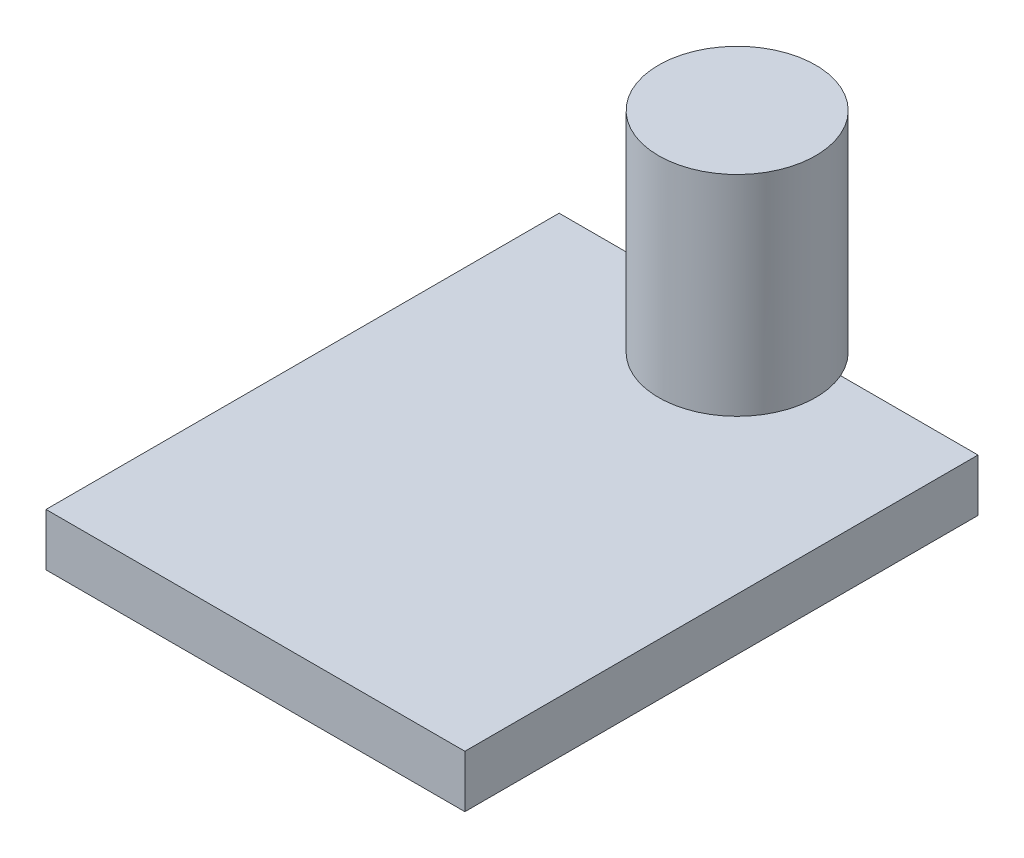
ISO-10303-21;
HEADER;
FILE_DESCRIPTION(('STEP AP214'),'2;1');
FILE_NAME('part.step','',(''),(''),'','','');
FILE_SCHEMA(('AUTOMOTIVE_DESIGN { 1 0 10303 214 1 1 1 1 }'));
ENDSEC;
DATA;
#1=APPLICATION_CONTEXT('core data for automotive mechanical design processes');
#2=APPLICATION_PROTOCOL_DEFINITION('international standard','automotive_design',2000,#1);
#3=PRODUCT_CONTEXT('',#1,'mechanical');
#4=PRODUCT('Part','Part','',(#3));
#5=PRODUCT_RELATED_PRODUCT_CATEGORY('part','',(#4));
#6=PRODUCT_DEFINITION_FORMATION('','',#4);
#7=PRODUCT_DEFINITION_CONTEXT('part definition',#1,'design');
#8=PRODUCT_DEFINITION('design','',#6,#7);
#9=PRODUCT_DEFINITION_SHAPE('','',#8);
#10=(LENGTH_UNIT() NAMED_UNIT(*) SI_UNIT(.MILLI.,.METRE.));
#11=(NAMED_UNIT(*) PLANE_ANGLE_UNIT() SI_UNIT($,.RADIAN.));
#12=(NAMED_UNIT(*) SI_UNIT($,.STERADIAN.) SOLID_ANGLE_UNIT());
#13=UNCERTAINTY_MEASURE_WITH_UNIT(LENGTH_MEASURE(1.E-05),#10,'distance_accuracy_value','');
#14=(GEOMETRIC_REPRESENTATION_CONTEXT(3) GLOBAL_UNCERTAINTY_ASSIGNED_CONTEXT((#13)) GLOBAL_UNIT_ASSIGNED_CONTEXT((#10,
#11,#12)) REPRESENTATION_CONTEXT('',''));
#15=CARTESIAN_POINT('',(0.,0.,0.));
#16=DIRECTION('',(0.,0.,1.));
#17=DIRECTION('',(1.,0.,0.));
#18=AXIS2_PLACEMENT_3D('',#15,#16,#17);
#19=CARTESIAN_POINT('',(-20.,5.,24.5));
#20=DIRECTION('',(1.,0.,0.));
#21=DIRECTION('',(0.,0.,-1.));
#22=AXIS2_PLACEMENT_3D('',#19,#20,#21);
#23=PLANE('',#22);
#24=DIRECTION('',(0.,0.,1.));
#25=VECTOR('',#24,1.);
#26=CARTESIAN_POINT('',(-20.,0.,24.5));
#27=LINE('',#26,#25);
#28=CARTESIAN_POINT('',(-20.,0.,-24.5));
#29=VERTEX_POINT('',#28);
#30=CARTESIAN_POINT('',(-20.,0.,24.5));
#31=VERTEX_POINT('',#30);
#32=EDGE_CURVE('E118',#29,#31,#27,.T.);
#33=ORIENTED_EDGE('',*,*,#32,.T.);
#34=DIRECTION('',(0.,-1.,0.));
#35=VECTOR('',#34,1.);
#36=CARTESIAN_POINT('',(-20.,5.,24.5));
#37=LINE('',#36,#35);
#38=CARTESIAN_POINT('',(-20.,5.,24.5));
#39=VERTEX_POINT('',#38);
#40=EDGE_CURVE('E50',#39,#31,#37,.T.);
#41=ORIENTED_EDGE('',*,*,#40,.F.);
#42=DIRECTION('',(0.,0.,1.));
#43=VECTOR('',#42,1.);
#44=CARTESIAN_POINT('',(-20.,5.,24.5));
#45=LINE('',#44,#43);
#46=CARTESIAN_POINT('',(-20.,5.,-24.5));
#47=VERTEX_POINT('',#46);
#48=EDGE_CURVE('E121',#47,#39,#45,.T.);
#49=ORIENTED_EDGE('',*,*,#48,.F.);
#50=DIRECTION('',(0.,-1.,0.));
#51=VECTOR('',#50,1.);
#52=CARTESIAN_POINT('',(-20.,5.,-24.5));
#53=LINE('',#52,#51);
#54=EDGE_CURVE('E105',#47,#29,#53,.T.);
#55=ORIENTED_EDGE('',*,*,#54,.T.);
#56=EDGE_LOOP('',(#33,#41,#49,#55));
#57=FACE_BOUND('',#56,.T.);
#58=ADVANCED_FACE('F47',(#57),#23,.F.);
#59=CARTESIAN_POINT('',(20.,5.,24.5));
#60=DIRECTION('',(0.,0.,-1.));
#61=DIRECTION('',(-1.,0.,0.));
#62=AXIS2_PLACEMENT_3D('',#59,#60,#61);
#63=PLANE('',#62);
#64=DIRECTION('',(1.,0.,0.));
#65=VECTOR('',#64,1.);
#66=CARTESIAN_POINT('',(20.,0.,24.5));
#67=LINE('',#66,#65);
#68=CARTESIAN_POINT('',(20.,0.,24.5));
#69=VERTEX_POINT('',#68);
#70=EDGE_CURVE('E127',#31,#69,#67,.T.);
#71=ORIENTED_EDGE('',*,*,#70,.T.);
#72=DIRECTION('',(0.,-1.,0.));
#73=VECTOR('',#72,1.);
#74=CARTESIAN_POINT('',(20.,5.,24.5));
#75=LINE('',#74,#73);
#76=CARTESIAN_POINT('',(20.,5.,24.5));
#77=VERTEX_POINT('',#76);
#78=EDGE_CURVE('E134',#77,#69,#75,.T.);
#79=ORIENTED_EDGE('',*,*,#78,.F.);
#80=DIRECTION('',(1.,0.,0.));
#81=VECTOR('',#80,1.);
#82=CARTESIAN_POINT('',(20.,5.,24.5));
#83=LINE('',#82,#81);
#84=EDGE_CURVE('E96',#39,#77,#83,.T.);
#85=ORIENTED_EDGE('',*,*,#84,.F.);
#86=ORIENTED_EDGE('',*,*,#40,.T.);
#87=EDGE_LOOP('',(#71,#79,#85,#86));
#88=FACE_BOUND('',#87,.T.);
#89=ADVANCED_FACE('F139',(#88),#63,.F.);
#90=CARTESIAN_POINT('',(20.,5.,24.5));
#91=DIRECTION('',(-1.,0.,0.));
#92=DIRECTION('',(0.,0.,1.));
#93=AXIS2_PLACEMENT_3D('',#90,#91,#92);
#94=PLANE('',#93);
#95=DIRECTION('',(0.,0.,-1.));
#96=VECTOR('',#95,1.);
#97=CARTESIAN_POINT('',(20.,0.,24.5));
#98=LINE('',#97,#96);
#99=CARTESIAN_POINT('',(20.,0.,-24.5));
#100=VERTEX_POINT('',#99);
#101=EDGE_CURVE('E129',#69,#100,#98,.T.);
#102=ORIENTED_EDGE('',*,*,#101,.T.);
#103=DIRECTION('',(0.,-1.,0.));
#104=VECTOR('',#103,1.);
#105=CARTESIAN_POINT('',(20.,5.,-24.5));
#106=LINE('',#105,#104);
#107=CARTESIAN_POINT('',(20.,5.,-24.5));
#108=VERTEX_POINT('',#107);
#109=EDGE_CURVE('E133',#108,#100,#106,.T.);
#110=ORIENTED_EDGE('',*,*,#109,.F.);
#111=DIRECTION('',(0.,0.,-1.));
#112=VECTOR('',#111,1.);
#113=CARTESIAN_POINT('',(20.,5.,24.5));
#114=LINE('',#113,#112);
#115=EDGE_CURVE('E103',#77,#108,#114,.T.);
#116=ORIENTED_EDGE('',*,*,#115,.F.);
#117=ORIENTED_EDGE('',*,*,#78,.T.);
#118=EDGE_LOOP('',(#102,#110,#116,#117));
#119=FACE_BOUND('',#118,.T.);
#120=ADVANCED_FACE('F145',(#119),#94,.F.);
#121=CARTESIAN_POINT('',(20.,5.,-24.5));
#122=DIRECTION('',(0.,0.,1.));
#123=DIRECTION('',(1.,0.,0.));
#124=AXIS2_PLACEMENT_3D('',#121,#122,#123);
#125=PLANE('',#124);
#126=DIRECTION('',(-1.,0.,0.));
#127=VECTOR('',#126,1.);
#128=CARTESIAN_POINT('',(20.,0.,-24.5));
#129=LINE('',#128,#127);
#130=EDGE_CURVE('E88',#100,#29,#129,.T.);
#131=ORIENTED_EDGE('',*,*,#130,.T.);
#132=ORIENTED_EDGE('',*,*,#54,.F.);
#133=DIRECTION('',(-1.,0.,0.));
#134=VECTOR('',#133,1.);
#135=CARTESIAN_POINT('',(20.,5.,-24.5));
#136=LINE('',#135,#134);
#137=CARTESIAN_POINT('',(-6.87386354243376,5.,-24.5));
#138=VERTEX_POINT('',#137);
#139=EDGE_CURVE('E66',#138,#47,#136,.T.);
#140=ORIENTED_EDGE('',*,*,#139,.F.);
#141=CARTESIAN_POINT('',(6.87386354243376,5.,-24.5));
#142=VERTEX_POINT('',#141);
#143=EDGE_CURVE('E106',#142,#138,#136,.T.);
#144=ORIENTED_EDGE('',*,*,#143,.F.);
#145=EDGE_CURVE('E99',#108,#142,#136,.T.);
#146=ORIENTED_EDGE('',*,*,#145,.F.);
#147=ORIENTED_EDGE('',*,*,#109,.T.);
#148=EDGE_LOOP('',(#131,#132,#140,#144,#146,#147));
#149=FACE_BOUND('',#148,.T.);
#150=ADVANCED_FACE('F109',(#149),#125,.F.);
#151=CARTESIAN_POINT('',(0.,5.,0.));
#152=DIRECTION('',(0.,1.,0.));
#153=DIRECTION('',(0.,0.,1.));
#154=AXIS2_PLACEMENT_3D('',#151,#152,#153);
#155=PLANE('',#154);
#156=CARTESIAN_POINT('',(0.,5.,-21.5));
#157=DIRECTION('',(0.,1.,0.));
#158=DIRECTION('',(0.,0.,1.));
#159=AXIS2_PLACEMENT_3D('',#156,#157,#158);
#160=CIRCLE('',#159,7.5);
#161=EDGE_CURVE('E11',#138,#142,#160,.T.);
#162=ORIENTED_EDGE('',*,*,#161,.F.);
#163=ORIENTED_EDGE('',*,*,#139,.T.);
#164=ORIENTED_EDGE('',*,*,#48,.T.);
#165=ORIENTED_EDGE('',*,*,#84,.T.);
#166=ORIENTED_EDGE('',*,*,#115,.T.);
#167=ORIENTED_EDGE('',*,*,#145,.T.);
#168=EDGE_LOOP('',(#162,#163,#164,#165,#166,#167));
#169=FACE_BOUND('',#168,.T.);
#170=ADVANCED_FACE('F101',(#169),#155,.T.);
#171=CARTESIAN_POINT('',(0.,0.,0.));
#172=DIRECTION('',(0.,1.,0.));
#173=DIRECTION('',(0.,0.,1.));
#174=AXIS2_PLACEMENT_3D('',#171,#172,#173);
#175=PLANE('',#174);
#176=ORIENTED_EDGE('',*,*,#32,.F.);
#177=ORIENTED_EDGE('',*,*,#130,.F.);
#178=ORIENTED_EDGE('',*,*,#101,.F.);
#179=ORIENTED_EDGE('',*,*,#70,.F.);
#180=EDGE_LOOP('',(#176,#177,#178,#179));
#181=FACE_BOUND('',#180,.T.);
#182=ADVANCED_FACE('F144',(#181),#175,.F.);
#183=CARTESIAN_POINT('',(0.,5.,-21.5));
#184=DIRECTION('',(0.,1.,0.));
#185=DIRECTION('',(0.,0.,1.));
#186=AXIS2_PLACEMENT_3D('',#183,#184,#185);
#187=PLANE('',#186);
#188=EDGE_CURVE('E56',#142,#138,#160,.T.);
#189=ORIENTED_EDGE('',*,*,#188,.F.);
#190=ORIENTED_EDGE('',*,*,#143,.T.);
#191=EDGE_LOOP('',(#189,#190));
#192=FACE_BOUND('',#191,.T.);
#193=ADVANCED_FACE('F115',(#192),#187,.F.);
#194=CARTESIAN_POINT('',(0.,25.,-21.5));
#195=DIRECTION('',(0.,-1.,0.));
#196=DIRECTION('',(0.,0.,-1.));
#197=AXIS2_PLACEMENT_3D('',#194,#195,#196);
#198=CYLINDRICAL_SURFACE('',#197,7.5);
#199=CARTESIAN_POINT('',(0.,25.,-21.5));
#200=DIRECTION('',(0.,1.,0.));
#201=DIRECTION('',(0.,0.,1.));
#202=AXIS2_PLACEMENT_3D('',#199,#200,#201);
#203=CIRCLE('',#202,7.5);
#204=CARTESIAN_POINT('',(0.,25.,-14.));
#205=VERTEX_POINT('',#204);
#206=EDGE_CURVE('E116',#205,#205,#203,.T.);
#207=ORIENTED_EDGE('',*,*,#206,.F.);
#208=EDGE_LOOP('',(#207));
#209=FACE_BOUND('',#208,.T.);
#210=ORIENTED_EDGE('',*,*,#188,.T.);
#211=ORIENTED_EDGE('',*,*,#161,.T.);
#212=EDGE_LOOP('',(#210,#211));
#213=FACE_BOUND('',#212,.T.);
#214=ADVANCED_FACE('F114',(#209,#213),#198,.T.);
#215=CARTESIAN_POINT('',(0.,25.,-21.5));
#216=DIRECTION('',(0.,1.,0.));
#217=DIRECTION('',(0.,0.,1.));
#218=AXIS2_PLACEMENT_3D('',#215,#216,#217);
#219=PLANE('',#218);
#220=ORIENTED_EDGE('',*,*,#206,.T.);
#221=EDGE_LOOP('',(#220));
#222=FACE_BOUND('',#221,.T.);
#223=ADVANCED_FACE('F204',(#222),#219,.T.);
#224=CLOSED_SHELL('',(#58,#89,#120,#150,#170,#182,#193,#214,#223));
#225=MANIFOLD_SOLID_BREP('B2',#224);
#226=ADVANCED_BREP_SHAPE_REPRESENTATION('',(#18,#225),#14);
#227=SHAPE_DEFINITION_REPRESENTATION(#9,#226);
ENDSEC;
END-ISO-10303-21;
